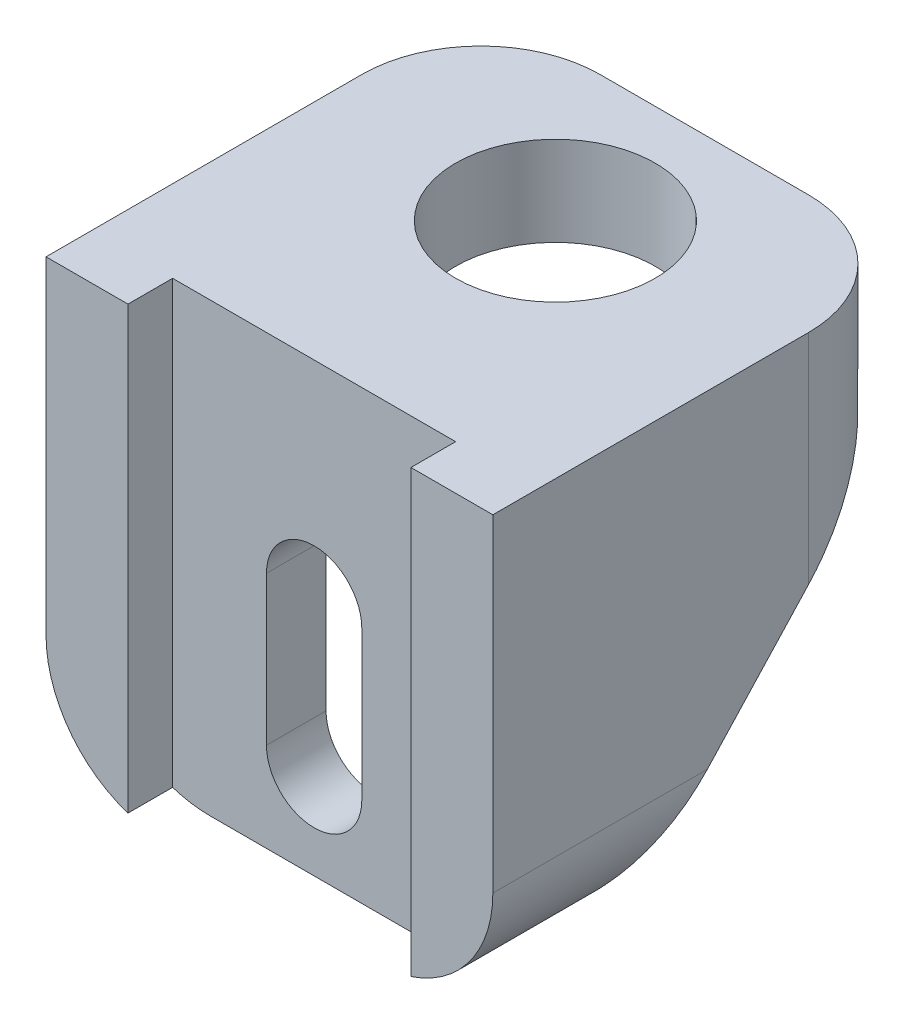
ISO-10303-21;
HEADER;
FILE_DESCRIPTION(('STEP AP214'),'2;1');
FILE_NAME('part.step','',(''),(''),'','','');
FILE_SCHEMA(('AUTOMOTIVE_DESIGN { 1 0 10303 214 1 1 1 1 }'));
ENDSEC;
DATA;
#1=APPLICATION_CONTEXT('core data for automotive mechanical design processes');
#2=APPLICATION_PROTOCOL_DEFINITION('international standard','automotive_design',2000,#1);
#3=PRODUCT_CONTEXT('',#1,'mechanical');
#4=PRODUCT('Part','Part','',(#3));
#5=PRODUCT_RELATED_PRODUCT_CATEGORY('part','',(#4));
#6=PRODUCT_DEFINITION_FORMATION('','',#4);
#7=PRODUCT_DEFINITION_CONTEXT('part definition',#1,'design');
#8=PRODUCT_DEFINITION('design','',#6,#7);
#9=PRODUCT_DEFINITION_SHAPE('','',#8);
#10=(LENGTH_UNIT() NAMED_UNIT(*) SI_UNIT(.MILLI.,.METRE.));
#11=(NAMED_UNIT(*) PLANE_ANGLE_UNIT() SI_UNIT($,.RADIAN.));
#12=(NAMED_UNIT(*) SI_UNIT($,.STERADIAN.) SOLID_ANGLE_UNIT());
#13=UNCERTAINTY_MEASURE_WITH_UNIT(LENGTH_MEASURE(1.E-05),#10,'distance_accuracy_value','');
#14=(GEOMETRIC_REPRESENTATION_CONTEXT(3) GLOBAL_UNCERTAINTY_ASSIGNED_CONTEXT((#13)) GLOBAL_UNIT_ASSIGNED_CONTEXT((#10,
#11,#12)) REPRESENTATION_CONTEXT('',''));
#15=CARTESIAN_POINT('',(0.,0.,0.));
#16=DIRECTION('',(0.,0.,1.));
#17=DIRECTION('',(1.,0.,0.));
#18=AXIS2_PLACEMENT_3D('',#15,#16,#17);
#19=CARTESIAN_POINT('',(0.,0.,0.));
#20=DIRECTION('',(0.,1.,0.));
#21=DIRECTION('',(0.,0.,1.));
#22=AXIS2_PLACEMENT_3D('',#19,#20,#21);
#23=PLANE('',#22);
#24=CARTESIAN_POINT('',(0.,0.,0.));
#25=DIRECTION('',(0.,1.,0.));
#26=DIRECTION('',(0.,0.,1.));
#27=AXIS2_PLACEMENT_3D('',#24,#25,#26);
#28=CIRCLE('',#27,3.35);
#29=CARTESIAN_POINT('',(0.,0.,3.35));
#30=VERTEX_POINT('',#29);
#31=EDGE_CURVE('E278',#30,#30,#28,.T.);
#32=ORIENTED_EDGE('',*,*,#31,.T.);
#33=EDGE_LOOP('',(#32));
#34=FACE_BOUND('',#33,.T.);
#35=DIRECTION('',(1.,0.,0.));
#36=VECTOR('',#35,1.);
#37=CARTESIAN_POINT('',(-7.5,0.,6.1));
#38=LINE('',#37,#36);
#39=CARTESIAN_POINT('',(-4.5,0.,6.1));
#40=VERTEX_POINT('',#39);
#41=CARTESIAN_POINT('',(4.5,0.,6.1));
#42=VERTEX_POINT('',#41);
#43=EDGE_CURVE('E271',#40,#42,#38,.T.);
#44=ORIENTED_EDGE('',*,*,#43,.F.);
#45=CARTESIAN_POINT('',(-4.5,0.,4.1));
#46=DIRECTION('',(0.,1.,0.));
#47=DIRECTION('',(0.,0.,1.));
#48=AXIS2_PLACEMENT_3D('',#45,#46,#47);
#49=CIRCLE('',#48,2.);
#50=CARTESIAN_POINT('',(-6.5,0.,4.1));
#51=VERTEX_POINT('',#50);
#52=EDGE_CURVE('E367',#40,#51,#49,.F.);
#53=ORIENTED_EDGE('',*,*,#52,.T.);
#54=DIRECTION('',(0.,0.,1.));
#55=VECTOR('',#54,1.);
#56=CARTESIAN_POINT('',(-6.5,0.,-5.));
#57=LINE('',#56,#55);
#58=CARTESIAN_POINT('',(-6.5,0.,-3.64575131106459));
#59=VERTEX_POINT('',#58);
#60=EDGE_CURVE('E501',#59,#51,#57,.T.);
#61=ORIENTED_EDGE('',*,*,#60,.F.);
#62=CARTESIAN_POINT('',(-3.5,0.,-1.));
#63=DIRECTION('',(0.,1.,0.));
#64=DIRECTION('',(0.,0.,1.));
#65=AXIS2_PLACEMENT_3D('',#62,#63,#64);
#66=CIRCLE('',#65,4.);
#67=CARTESIAN_POINT('',(-3.5,0.,-5.));
#68=VERTEX_POINT('',#67);
#69=EDGE_CURVE('E346',#59,#68,#66,.F.);
#70=ORIENTED_EDGE('',*,*,#69,.T.);
#71=DIRECTION('',(-1.,0.,0.));
#72=VECTOR('',#71,1.);
#73=CARTESIAN_POINT('',(-7.5,0.,-5.));
#74=LINE('',#73,#72);
#75=CARTESIAN_POINT('',(3.5,0.,-5.));
#76=VERTEX_POINT('',#75);
#77=EDGE_CURVE('E284',#76,#68,#74,.T.);
#78=ORIENTED_EDGE('',*,*,#77,.F.);
#79=CARTESIAN_POINT('',(3.5,0.,-1.));
#80=DIRECTION('',(0.,1.,0.));
#81=DIRECTION('',(0.,0.,1.));
#82=AXIS2_PLACEMENT_3D('',#79,#80,#81);
#83=CIRCLE('',#82,4.);
#84=CARTESIAN_POINT('',(6.5,0.,-3.64575131106459));
#85=VERTEX_POINT('',#84);
#86=EDGE_CURVE('E344',#76,#85,#83,.F.);
#87=ORIENTED_EDGE('',*,*,#86,.T.);
#88=DIRECTION('',(0.,0.,1.));
#89=VECTOR('',#88,1.);
#90=CARTESIAN_POINT('',(6.5,0.,-5.));
#91=LINE('',#90,#89);
#92=CARTESIAN_POINT('',(6.5,0.,4.1));
#93=VERTEX_POINT('',#92);
#94=EDGE_CURVE('E517',#85,#93,#91,.T.);
#95=ORIENTED_EDGE('',*,*,#94,.T.);
#96=CARTESIAN_POINT('',(4.5,0.,4.1));
#97=DIRECTION('',(0.,1.,0.));
#98=DIRECTION('',(0.,0.,1.));
#99=AXIS2_PLACEMENT_3D('',#96,#97,#98);
#100=CIRCLE('',#99,2.);
#101=EDGE_CURVE('E365',#93,#42,#100,.F.);
#102=ORIENTED_EDGE('',*,*,#101,.T.);
#103=EDGE_LOOP('',(#44,#53,#61,#70,#78,#87,#95,#102));
#104=FACE_BOUND('',#103,.T.);
#105=ADVANCED_FACE('F41',(#34,#104),#23,.F.);
#106=CARTESIAN_POINT('',(-7.5,-12.,6.1));
#107=DIRECTION('',(0.,0.,1.));
#108=DIRECTION('',(1.,0.,0.));
#109=AXIS2_PLACEMENT_3D('',#106,#107,#108);
#110=PLANE('',#109);
#111=DIRECTION('',(0.,-1.,0.));
#112=VECTOR('',#111,1.);
#113=CARTESIAN_POINT('',(1.6,-4.,6.1));
#114=LINE('',#113,#112);
#115=CARTESIAN_POINT('',(1.6,-4.,6.1));
#116=VERTEX_POINT('',#115);
#117=CARTESIAN_POINT('',(1.6,-9.,6.1));
#118=VERTEX_POINT('',#117);
#119=EDGE_CURVE('E231',#116,#118,#114,.T.);
#120=ORIENTED_EDGE('',*,*,#119,.F.);
#121=CARTESIAN_POINT('',(0.,-4.,6.1));
#122=DIRECTION('',(0.,0.,-1.));
#123=DIRECTION('',(-1.,0.,0.));
#124=AXIS2_PLACEMENT_3D('',#121,#122,#123);
#125=CIRCLE('',#124,1.6);
#126=CARTESIAN_POINT('',(-1.6,-4.,6.1));
#127=VERTEX_POINT('',#126);
#128=EDGE_CURVE('E210',#127,#116,#125,.T.);
#129=ORIENTED_EDGE('',*,*,#128,.F.);
#130=DIRECTION('',(0.,1.,0.));
#131=VECTOR('',#130,1.);
#132=CARTESIAN_POINT('',(-1.6,-4.,6.1));
#133=LINE('',#132,#131);
#134=CARTESIAN_POINT('',(-1.6,-9.,6.1));
#135=VERTEX_POINT('',#134);
#136=EDGE_CURVE('E215',#135,#127,#133,.T.);
#137=ORIENTED_EDGE('',*,*,#136,.F.);
#138=CARTESIAN_POINT('',(0.,-9.,6.1));
#139=DIRECTION('',(0.,0.,-1.));
#140=DIRECTION('',(-1.,0.,0.));
#141=AXIS2_PLACEMENT_3D('',#138,#139,#140);
#142=CIRCLE('',#141,1.6);
#143=EDGE_CURVE('E238',#118,#135,#142,.T.);
#144=ORIENTED_EDGE('',*,*,#143,.F.);
#145=EDGE_LOOP('',(#120,#129,#137,#144));
#146=FACE_BOUND('',#145,.T.);
#147=CARTESIAN_POINT('',(-3.5,-8.,6.1));
#148=DIRECTION('',(0.,0.,1.));
#149=DIRECTION('',(1.,0.,0.));
#150=AXIS2_PLACEMENT_3D('',#147,#148,#149);
#151=CIRCLE('',#150,4.);
#152=CARTESIAN_POINT('',(-3.5,-12.,6.1));
#153=VERTEX_POINT('',#152);
#154=CARTESIAN_POINT('',(-4.5,-11.8729833462074,6.1));
#155=VERTEX_POINT('',#154);
#156=EDGE_CURVE('E308',#153,#155,#151,.F.);
#157=ORIENTED_EDGE('',*,*,#156,.T.);
#158=DIRECTION('',(0.,-1.,0.));
#159=VECTOR('',#158,1.);
#160=CARTESIAN_POINT('',(-4.5,0.,6.1));
#161=LINE('',#160,#159);
#162=EDGE_CURVE('E363',#155,#40,#161,.F.);
#163=ORIENTED_EDGE('',*,*,#162,.T.);
#164=ORIENTED_EDGE('',*,*,#43,.T.);
#165=DIRECTION('',(0.,-1.,0.));
#166=VECTOR('',#165,1.);
#167=CARTESIAN_POINT('',(4.5,-10.6457513110646,6.1));
#168=LINE('',#167,#166);
#169=CARTESIAN_POINT('',(4.5,-11.8729833462074,6.1));
#170=VERTEX_POINT('',#169);
#171=EDGE_CURVE('E360',#42,#170,#168,.T.);
#172=ORIENTED_EDGE('',*,*,#171,.T.);
#173=CARTESIAN_POINT('',(3.5,-8.,6.1));
#174=DIRECTION('',(0.,0.,1.));
#175=DIRECTION('',(1.,0.,0.));
#176=AXIS2_PLACEMENT_3D('',#173,#174,#175);
#177=CIRCLE('',#176,4.);
#178=CARTESIAN_POINT('',(3.5,-12.,6.1));
#179=VERTEX_POINT('',#178);
#180=EDGE_CURVE('E306',#170,#179,#177,.F.);
#181=ORIENTED_EDGE('',*,*,#180,.T.);
#182=DIRECTION('',(1.,0.,0.));
#183=VECTOR('',#182,1.);
#184=CARTESIAN_POINT('',(-7.5,-12.,6.1));
#185=LINE('',#184,#183);
#186=EDGE_CURVE('E272',#153,#179,#185,.T.);
#187=ORIENTED_EDGE('',*,*,#186,.F.);
#188=EDGE_LOOP('',(#157,#163,#164,#172,#181,#187));
#189=FACE_BOUND('',#188,.T.);
#190=ADVANCED_FACE('F411',(#146,#189),#110,.F.);
#191=CARTESIAN_POINT('',(-7.5,3.,8.1));
#192=DIRECTION('',(0.,0.,-1.));
#193=DIRECTION('',(-1.,0.,0.));
#194=AXIS2_PLACEMENT_3D('',#191,#192,#193);
#195=PLANE('',#194);
#196=DIRECTION('',(0.,-1.,0.));
#197=VECTOR('',#196,1.);
#198=CARTESIAN_POINT('',(-1.6,-4.,8.1));
#199=LINE('',#198,#197);
#200=CARTESIAN_POINT('',(-1.6,-4.,8.1));
#201=VERTEX_POINT('',#200);
#202=CARTESIAN_POINT('',(-1.6,-9.,8.1));
#203=VERTEX_POINT('',#202);
#204=EDGE_CURVE('E229',#201,#203,#199,.T.);
#205=ORIENTED_EDGE('',*,*,#204,.F.);
#206=CARTESIAN_POINT('',(0.,-4.,8.1));
#207=DIRECTION('',(0.,0.,-1.));
#208=DIRECTION('',(-1.,0.,0.));
#209=AXIS2_PLACEMENT_3D('',#206,#207,#208);
#210=CIRCLE('',#209,1.6);
#211=CARTESIAN_POINT('',(1.6,-4.,8.1));
#212=VERTEX_POINT('',#211);
#213=EDGE_CURVE('E207',#212,#201,#210,.F.);
#214=ORIENTED_EDGE('',*,*,#213,.F.);
#215=DIRECTION('',(0.,1.,0.));
#216=VECTOR('',#215,1.);
#217=CARTESIAN_POINT('',(1.6,-4.,8.1));
#218=LINE('',#217,#216);
#219=CARTESIAN_POINT('',(1.6,-9.,8.1));
#220=VERTEX_POINT('',#219);
#221=EDGE_CURVE('E219',#220,#212,#218,.T.);
#222=ORIENTED_EDGE('',*,*,#221,.F.);
#223=CARTESIAN_POINT('',(0.,-9.,8.1));
#224=DIRECTION('',(0.,0.,-1.));
#225=DIRECTION('',(-1.,0.,0.));
#226=AXIS2_PLACEMENT_3D('',#223,#224,#225);
#227=CIRCLE('',#226,1.6);
#228=EDGE_CURVE('E233',#203,#220,#227,.F.);
#229=ORIENTED_EDGE('',*,*,#228,.F.);
#230=EDGE_LOOP('',(#205,#214,#222,#229));
#231=FACE_BOUND('',#230,.T.);
#232=DIRECTION('',(0.,1.,0.));
#233=VECTOR('',#232,1.);
#234=CARTESIAN_POINT('',(-4.75,-15.1324910215354,8.1));
#235=LINE('',#234,#233);
#236=CARTESIAN_POINT('',(-4.75,-11.7996710383927,8.1));
#237=VERTEX_POINT('',#236);
#238=CARTESIAN_POINT('',(-4.75,3.,8.1));
#239=VERTEX_POINT('',#238);
#240=EDGE_CURVE('E265',#237,#239,#235,.T.);
#241=ORIENTED_EDGE('',*,*,#240,.F.);
#242=CARTESIAN_POINT('',(-3.5,-8.,8.1));
#243=DIRECTION('',(0.,0.,-1.));
#244=DIRECTION('',(-1.,0.,0.));
#245=AXIS2_PLACEMENT_3D('',#242,#243,#244);
#246=CIRCLE('',#245,4.);
#247=CARTESIAN_POINT('',(-3.5,-12.,8.1));
#248=VERTEX_POINT('',#247);
#249=EDGE_CURVE('E328',#237,#248,#246,.F.);
#250=ORIENTED_EDGE('',*,*,#249,.T.);
#251=DIRECTION('',(-1.,0.,0.));
#252=VECTOR('',#251,1.);
#253=CARTESIAN_POINT('',(-7.5,-12.,8.1));
#254=LINE('',#253,#252);
#255=CARTESIAN_POINT('',(3.5,-12.,8.1));
#256=VERTEX_POINT('',#255);
#257=EDGE_CURVE('E275',#256,#248,#254,.T.);
#258=ORIENTED_EDGE('',*,*,#257,.F.);
#259=CARTESIAN_POINT('',(3.5,-8.,8.1));
#260=DIRECTION('',(0.,0.,-1.));
#261=DIRECTION('',(-1.,0.,0.));
#262=AXIS2_PLACEMENT_3D('',#259,#260,#261);
#263=CIRCLE('',#262,4.);
#264=CARTESIAN_POINT('',(4.75,-11.7996710383927,8.1));
#265=VERTEX_POINT('',#264);
#266=EDGE_CURVE('E326',#256,#265,#263,.F.);
#267=ORIENTED_EDGE('',*,*,#266,.T.);
#268=DIRECTION('',(0.,1.,0.));
#269=VECTOR('',#268,1.);
#270=CARTESIAN_POINT('',(4.75,-15.1324910215354,8.1));
#271=LINE('',#270,#269);
#272=CARTESIAN_POINT('',(4.75,3.,8.1));
#273=VERTEX_POINT('',#272);
#274=EDGE_CURVE('E247',#265,#273,#271,.T.);
#275=ORIENTED_EDGE('',*,*,#274,.T.);
#276=DIRECTION('',(1.,0.,0.));
#277=VECTOR('',#276,1.);
#278=CARTESIAN_POINT('',(-7.5,3.,8.1));
#279=LINE('',#278,#277);
#280=EDGE_CURVE('E289',#239,#273,#279,.T.);
#281=ORIENTED_EDGE('',*,*,#280,.F.);
#282=EDGE_LOOP('',(#241,#250,#258,#267,#275,#281));
#283=FACE_BOUND('',#282,.T.);
#284=ADVANCED_FACE('F226',(#231,#283),#195,.F.);
#285=CARTESIAN_POINT('',(0.,3.,0.));
#286=DIRECTION('',(0.,1.,0.));
#287=DIRECTION('',(0.,0.,1.));
#288=AXIS2_PLACEMENT_3D('',#285,#286,#287);
#289=PLANE('',#288);
#290=DIRECTION('',(-1.,0.,0.));
#291=VECTOR('',#290,1.);
#292=CARTESIAN_POINT('',(-7.5,3.,-5.));
#293=LINE('',#292,#291);
#294=CARTESIAN_POINT('',(3.5,3.,-5.));
#295=VERTEX_POINT('',#294);
#296=CARTESIAN_POINT('',(-3.5,3.,-5.));
#297=VERTEX_POINT('',#296);
#298=EDGE_CURVE('E295',#295,#297,#293,.T.);
#299=ORIENTED_EDGE('',*,*,#298,.T.);
#300=CARTESIAN_POINT('',(-3.5,3.,-1.));
#301=DIRECTION('',(0.,1.,0.));
#302=DIRECTION('',(0.,0.,1.));
#303=AXIS2_PLACEMENT_3D('',#300,#301,#302);
#304=CIRCLE('',#303,4.);
#305=CARTESIAN_POINT('',(-7.5,3.,-1.));
#306=VERTEX_POINT('',#305);
#307=EDGE_CURVE('E355',#297,#306,#304,.T.);
#308=ORIENTED_EDGE('',*,*,#307,.T.);
#309=DIRECTION('',(0.,0.,1.));
#310=VECTOR('',#309,1.);
#311=CARTESIAN_POINT('',(-7.5,3.,-5.));
#312=LINE('',#311,#310);
#313=CARTESIAN_POINT('',(-7.5,3.,9.6));
#314=VERTEX_POINT('',#313);
#315=EDGE_CURVE('E287',#306,#314,#312,.T.);
#316=ORIENTED_EDGE('',*,*,#315,.T.);
#317=DIRECTION('',(1.,0.,0.));
#318=VECTOR('',#317,1.);
#319=CARTESIAN_POINT('',(-7.5,3.,9.6));
#320=LINE('',#319,#318);
#321=CARTESIAN_POINT('',(-4.75,3.,9.6));
#322=VERTEX_POINT('',#321);
#323=EDGE_CURVE('E256',#314,#322,#320,.T.);
#324=ORIENTED_EDGE('',*,*,#323,.T.);
#325=DIRECTION('',(0.,0.,-1.));
#326=VECTOR('',#325,1.);
#327=CARTESIAN_POINT('',(-4.75,3.,8.1));
#328=LINE('',#327,#326);
#329=EDGE_CURVE('E259',#322,#239,#328,.T.);
#330=ORIENTED_EDGE('',*,*,#329,.T.);
#331=ORIENTED_EDGE('',*,*,#280,.T.);
#332=DIRECTION('',(0.,0.,1.));
#333=VECTOR('',#332,1.);
#334=CARTESIAN_POINT('',(4.75,3.,8.1));
#335=LINE('',#334,#333);
#336=CARTESIAN_POINT('',(4.75,3.,9.6));
#337=VERTEX_POINT('',#336);
#338=EDGE_CURVE('E253',#273,#337,#335,.T.);
#339=ORIENTED_EDGE('',*,*,#338,.T.);
#340=DIRECTION('',(1.,0.,0.));
#341=VECTOR('',#340,1.);
#342=CARTESIAN_POINT('',(7.5,3.,9.6));
#343=LINE('',#342,#341);
#344=CARTESIAN_POINT('',(7.5,3.,9.6));
#345=VERTEX_POINT('',#344);
#346=EDGE_CURVE('E249',#337,#345,#343,.T.);
#347=ORIENTED_EDGE('',*,*,#346,.T.);
#348=DIRECTION('',(0.,0.,-1.));
#349=VECTOR('',#348,1.);
#350=CARTESIAN_POINT('',(7.5,3.,-5.));
#351=LINE('',#350,#349);
#352=CARTESIAN_POINT('',(7.5,3.,-1.));
#353=VERTEX_POINT('',#352);
#354=EDGE_CURVE('E292',#345,#353,#351,.T.);
#355=ORIENTED_EDGE('',*,*,#354,.T.);
#356=CARTESIAN_POINT('',(3.5,3.,-1.));
#357=DIRECTION('',(0.,1.,0.));
#358=DIRECTION('',(0.,0.,1.));
#359=AXIS2_PLACEMENT_3D('',#356,#357,#358);
#360=CIRCLE('',#359,4.);
#361=EDGE_CURVE('E353',#353,#295,#360,.T.);
#362=ORIENTED_EDGE('',*,*,#361,.T.);
#363=EDGE_LOOP('',(#299,#308,#316,#324,#330,#331,#339,#347,#355,#362));
#364=FACE_BOUND('',#363,.T.);
#365=CARTESIAN_POINT('',(0.,3.,0.));
#366=DIRECTION('',(0.,1.,0.));
#367=DIRECTION('',(0.,0.,1.));
#368=AXIS2_PLACEMENT_3D('',#365,#366,#367);
#369=CIRCLE('',#368,3.35);
#370=CARTESIAN_POINT('',(0.,3.,3.35));
#371=VERTEX_POINT('',#370);
#372=EDGE_CURVE('E281',#371,#371,#369,.T.);
#373=ORIENTED_EDGE('',*,*,#372,.F.);
#374=EDGE_LOOP('',(#373));
#375=FACE_BOUND('',#374,.T.);
#376=ADVANCED_FACE('F422',(#364,#375),#289,.T.);
#377=CARTESIAN_POINT('',(-7.5,3.,-5.));
#378=DIRECTION('',(1.,0.,0.));
#379=DIRECTION('',(0.,0.,-1.));
#380=AXIS2_PLACEMENT_3D('',#377,#378,#379);
#381=PLANE('',#380);
#382=DIRECTION('',(0.,0.734099439586408,-0.679041981617427));
#383=VECTOR('',#382,1.);
#384=CARTESIAN_POINT('',(-7.5,-12.,6.1));
#385=LINE('',#384,#383);
#386=CARTESIAN_POINT('',(-7.5,-8.,2.4));
#387=VERTEX_POINT('',#386);
#388=CARTESIAN_POINT('',(-7.5,-4.32432432432432,-1.));
#389=VERTEX_POINT('',#388);
#390=EDGE_CURVE('E507',#387,#389,#385,.T.);
#391=ORIENTED_EDGE('',*,*,#390,.F.);
#392=DIRECTION('',(0.,0.,-1.));
#393=VECTOR('',#392,1.);
#394=CARTESIAN_POINT('',(-7.5,-8.,9.6));
#395=LINE('',#394,#393);
#396=CARTESIAN_POINT('',(-7.5,-8.,9.6));
#397=VERTEX_POINT('',#396);
#398=EDGE_CURVE('E320',#387,#397,#395,.F.);
#399=ORIENTED_EDGE('',*,*,#398,.T.);
#400=DIRECTION('',(0.,1.,0.));
#401=VECTOR('',#400,1.);
#402=CARTESIAN_POINT('',(-7.5,-15.1324910215354,9.6));
#403=LINE('',#402,#401);
#404=EDGE_CURVE('E267',#397,#314,#403,.T.);
#405=ORIENTED_EDGE('',*,*,#404,.T.);
#406=ORIENTED_EDGE('',*,*,#315,.F.);
#407=DIRECTION('',(0.,-1.,0.));
#408=VECTOR('',#407,1.);
#409=CARTESIAN_POINT('',(-7.5,3.,-1.));
#410=LINE('',#409,#408);
#411=EDGE_CURVE('E317',#306,#389,#410,.T.);
#412=ORIENTED_EDGE('',*,*,#411,.T.);
#413=EDGE_LOOP('',(#391,#399,#405,#406,#412));
#414=FACE_BOUND('',#413,.T.);
#415=ADVANCED_FACE('F393',(#414),#381,.F.);
#416=CARTESIAN_POINT('',(7.5,3.,-5.));
#417=DIRECTION('',(-1.,0.,0.));
#418=DIRECTION('',(0.,0.,1.));
#419=AXIS2_PLACEMENT_3D('',#416,#417,#418);
#420=PLANE('',#419);
#421=DIRECTION('',(0.,1.,0.));
#422=VECTOR('',#421,1.);
#423=CARTESIAN_POINT('',(7.5,-15.1324910215354,9.6));
#424=LINE('',#423,#422);
#425=CARTESIAN_POINT('',(7.5,-8.,9.6));
#426=VERTEX_POINT('',#425);
#427=EDGE_CURVE('E223',#426,#345,#424,.T.);
#428=ORIENTED_EDGE('',*,*,#427,.F.);
#429=DIRECTION('',(0.,0.,1.));
#430=VECTOR('',#429,1.);
#431=CARTESIAN_POINT('',(7.5,-8.,6.1));
#432=LINE('',#431,#430);
#433=CARTESIAN_POINT('',(7.5,-8.,2.4));
#434=VERTEX_POINT('',#433);
#435=EDGE_CURVE('E336',#426,#434,#432,.F.);
#436=ORIENTED_EDGE('',*,*,#435,.T.);
#437=DIRECTION('',(0.,0.734099439586408,-0.679041981617427));
#438=VECTOR('',#437,1.);
#439=CARTESIAN_POINT('',(7.5,-12.,6.1));
#440=LINE('',#439,#438);
#441=CARTESIAN_POINT('',(7.5,-4.32432432432432,-1.));
#442=VERTEX_POINT('',#441);
#443=EDGE_CURVE('E514',#434,#442,#440,.T.);
#444=ORIENTED_EDGE('',*,*,#443,.T.);
#445=DIRECTION('',(0.,-1.,0.));
#446=VECTOR('',#445,1.);
#447=CARTESIAN_POINT('',(7.5,3.,-1.));
#448=LINE('',#447,#446);
#449=EDGE_CURVE('E334',#442,#353,#448,.F.);
#450=ORIENTED_EDGE('',*,*,#449,.T.);
#451=ORIENTED_EDGE('',*,*,#354,.F.);
#452=EDGE_LOOP('',(#428,#436,#444,#450,#451));
#453=FACE_BOUND('',#452,.T.);
#454=ADVANCED_FACE('F428',(#453),#420,.F.);
#455=CARTESIAN_POINT('',(-7.5,3.,-5.));
#456=DIRECTION('',(0.,0.,1.));
#457=DIRECTION('',(1.,0.,0.));
#458=AXIS2_PLACEMENT_3D('',#455,#456,#457);
#459=PLANE('',#458);
#460=ORIENTED_EDGE('',*,*,#77,.T.);
#461=DIRECTION('',(0.,-1.,0.));
#462=VECTOR('',#461,1.);
#463=CARTESIAN_POINT('',(-3.5,3.,-5.));
#464=LINE('',#463,#462);
#465=EDGE_CURVE('E351',#68,#297,#464,.F.);
#466=ORIENTED_EDGE('',*,*,#465,.T.);
#467=ORIENTED_EDGE('',*,*,#298,.F.);
#468=DIRECTION('',(0.,-1.,0.));
#469=VECTOR('',#468,1.);
#470=CARTESIAN_POINT('',(3.5,3.,-5.));
#471=LINE('',#470,#469);
#472=EDGE_CURVE('E348',#295,#76,#471,.T.);
#473=ORIENTED_EDGE('',*,*,#472,.T.);
#474=EDGE_LOOP('',(#460,#466,#467,#473));
#475=FACE_BOUND('',#474,.T.);
#476=ADVANCED_FACE('F424',(#475),#459,.F.);
#477=CARTESIAN_POINT('',(0.,3.,0.));
#478=DIRECTION('',(0.,-1.,0.));
#479=DIRECTION('',(0.,0.,-1.));
#480=AXIS2_PLACEMENT_3D('',#477,#478,#479);
#481=CYLINDRICAL_SURFACE('',#480,3.35);
#482=ORIENTED_EDGE('',*,*,#372,.T.);
#483=EDGE_LOOP('',(#482));
#484=FACE_BOUND('',#483,.T.);
#485=ORIENTED_EDGE('',*,*,#31,.F.);
#486=EDGE_LOOP('',(#485));
#487=FACE_BOUND('',#486,.T.);
#488=ADVANCED_FACE('F427',(#484,#487),#481,.F.);
#489=CARTESIAN_POINT('',(0.,-12.,0.));
#490=DIRECTION('',(0.,-1.,0.));
#491=DIRECTION('',(0.,0.,-1.));
#492=AXIS2_PLACEMENT_3D('',#489,#490,#491);
#493=PLANE('',#492);
#494=ORIENTED_EDGE('',*,*,#257,.T.);
#495=DIRECTION('',(0.,0.,-1.));
#496=VECTOR('',#495,1.);
#497=CARTESIAN_POINT('',(-3.5,-12.,6.1));
#498=LINE('',#497,#496);
#499=EDGE_CURVE('E303',#248,#153,#498,.T.);
#500=ORIENTED_EDGE('',*,*,#499,.T.);
#501=ORIENTED_EDGE('',*,*,#186,.T.);
#502=DIRECTION('',(0.,0.,1.));
#503=VECTOR('',#502,1.);
#504=CARTESIAN_POINT('',(3.5,-12.,9.6));
#505=LINE('',#504,#503);
#506=EDGE_CURVE('E298',#179,#256,#505,.T.);
#507=ORIENTED_EDGE('',*,*,#506,.T.);
#508=EDGE_LOOP('',(#494,#500,#501,#507));
#509=FACE_BOUND('',#508,.T.);
#510=ADVANCED_FACE('F448',(#509),#493,.T.);
#511=CARTESIAN_POINT('',(-7.5,-15.1324910215354,9.6));
#512=DIRECTION('',(0.,0.,1.));
#513=DIRECTION('',(1.,0.,0.));
#514=AXIS2_PLACEMENT_3D('',#511,#512,#513);
#515=PLANE('',#514);
#516=ORIENTED_EDGE('',*,*,#404,.F.);
#517=CARTESIAN_POINT('',(-3.5,-8.,9.6));
#518=DIRECTION('',(0.,0.,1.));
#519=DIRECTION('',(1.,0.,0.));
#520=AXIS2_PLACEMENT_3D('',#517,#518,#519);
#521=CIRCLE('',#520,4.);
#522=CARTESIAN_POINT('',(-4.75,-11.7996710383927,9.6));
#523=VERTEX_POINT('',#522);
#524=EDGE_CURVE('E322',#397,#523,#521,.T.);
#525=ORIENTED_EDGE('',*,*,#524,.T.);
#526=DIRECTION('',(0.,1.,0.));
#527=VECTOR('',#526,1.);
#528=CARTESIAN_POINT('',(-4.75,-15.1324910215354,9.6));
#529=LINE('',#528,#527);
#530=EDGE_CURVE('E262',#523,#322,#529,.T.);
#531=ORIENTED_EDGE('',*,*,#530,.T.);
#532=ORIENTED_EDGE('',*,*,#323,.F.);
#533=EDGE_LOOP('',(#516,#525,#531,#532));
#534=FACE_BOUND('',#533,.T.);
#535=ADVANCED_FACE('F453',(#534),#515,.T.);
#536=CARTESIAN_POINT('',(-4.75,-15.1324910215354,8.1));
#537=DIRECTION('',(1.,0.,0.));
#538=DIRECTION('',(0.,0.,-1.));
#539=AXIS2_PLACEMENT_3D('',#536,#537,#538);
#540=PLANE('',#539);
#541=ORIENTED_EDGE('',*,*,#530,.F.);
#542=DIRECTION('',(0.,0.,1.));
#543=VECTOR('',#542,1.);
#544=CARTESIAN_POINT('',(-4.75,-11.7996710383927,9.6));
#545=LINE('',#544,#543);
#546=EDGE_CURVE('E324',#523,#237,#545,.F.);
#547=ORIENTED_EDGE('',*,*,#546,.T.);
#548=ORIENTED_EDGE('',*,*,#240,.T.);
#549=ORIENTED_EDGE('',*,*,#329,.F.);
#550=EDGE_LOOP('',(#541,#547,#548,#549));
#551=FACE_BOUND('',#550,.T.);
#552=ADVANCED_FACE('F459',(#551),#540,.T.);
#553=CARTESIAN_POINT('',(4.75,-15.1324910215354,8.1));
#554=DIRECTION('',(-1.,0.,0.));
#555=DIRECTION('',(0.,0.,1.));
#556=AXIS2_PLACEMENT_3D('',#553,#554,#555);
#557=PLANE('',#556);
#558=ORIENTED_EDGE('',*,*,#274,.F.);
#559=DIRECTION('',(0.,0.,-1.));
#560=VECTOR('',#559,1.);
#561=CARTESIAN_POINT('',(4.75,-11.7996710383927,8.1));
#562=LINE('',#561,#560);
#563=CARTESIAN_POINT('',(4.75,-11.7996710383927,9.6));
#564=VERTEX_POINT('',#563);
#565=EDGE_CURVE('E330',#265,#564,#562,.F.);
#566=ORIENTED_EDGE('',*,*,#565,.T.);
#567=DIRECTION('',(0.,1.,0.));
#568=VECTOR('',#567,1.);
#569=CARTESIAN_POINT('',(4.75,-15.1324910215354,9.6));
#570=LINE('',#569,#568);
#571=EDGE_CURVE('E250',#564,#337,#570,.T.);
#572=ORIENTED_EDGE('',*,*,#571,.T.);
#573=ORIENTED_EDGE('',*,*,#338,.F.);
#574=EDGE_LOOP('',(#558,#566,#572,#573));
#575=FACE_BOUND('',#574,.T.);
#576=ADVANCED_FACE('F463',(#575),#557,.T.);
#577=CARTESIAN_POINT('',(7.5,-15.1324910215354,9.6));
#578=DIRECTION('',(0.,0.,1.));
#579=DIRECTION('',(1.,0.,0.));
#580=AXIS2_PLACEMENT_3D('',#577,#578,#579);
#581=PLANE('',#580);
#582=ORIENTED_EDGE('',*,*,#571,.F.);
#583=CARTESIAN_POINT('',(3.5,-8.,9.6));
#584=DIRECTION('',(0.,0.,1.));
#585=DIRECTION('',(1.,0.,0.));
#586=AXIS2_PLACEMENT_3D('',#583,#584,#585);
#587=CIRCLE('',#586,4.);
#588=EDGE_CURVE('E332',#564,#426,#587,.T.);
#589=ORIENTED_EDGE('',*,*,#588,.T.);
#590=ORIENTED_EDGE('',*,*,#427,.T.);
#591=ORIENTED_EDGE('',*,*,#346,.F.);
#592=EDGE_LOOP('',(#582,#589,#590,#591));
#593=FACE_BOUND('',#592,.T.);
#594=ADVANCED_FACE('F465',(#593),#581,.T.);
#595=CARTESIAN_POINT('',(0.,-4.,9.601));
#596=DIRECTION('',(0.,0.,-1.));
#597=DIRECTION('',(-1.,0.,0.));
#598=AXIS2_PLACEMENT_3D('',#595,#596,#597);
#599=CYLINDRICAL_SURFACE('',#598,1.6);
#600=ORIENTED_EDGE('',*,*,#213,.T.);
#601=DIRECTION('',(0.,0.,-1.));
#602=VECTOR('',#601,1.);
#603=CARTESIAN_POINT('',(-1.6,-4.,9.601));
#604=LINE('',#603,#602);
#605=EDGE_CURVE('E224',#201,#127,#604,.T.);
#606=ORIENTED_EDGE('',*,*,#605,.T.);
#607=ORIENTED_EDGE('',*,*,#128,.T.);
#608=DIRECTION('',(0.,0.,-1.));
#609=VECTOR('',#608,1.);
#610=CARTESIAN_POINT('',(1.6,-4.,9.601));
#611=LINE('',#610,#609);
#612=EDGE_CURVE('E203',#212,#116,#611,.T.);
#613=ORIENTED_EDGE('',*,*,#612,.F.);
#614=EDGE_LOOP('',(#600,#606,#607,#613));
#615=FACE_BOUND('',#614,.T.);
#616=ADVANCED_FACE('F205',(#615),#599,.F.);
#617=CARTESIAN_POINT('',(-1.6,-4.,9.601));
#618=DIRECTION('',(-1.,0.,0.));
#619=DIRECTION('',(0.,-1.,0.));
#620=AXIS2_PLACEMENT_3D('',#617,#618,#619);
#621=PLANE('',#620);
#622=ORIENTED_EDGE('',*,*,#204,.T.);
#623=DIRECTION('',(0.,0.,-1.));
#624=VECTOR('',#623,1.);
#625=CARTESIAN_POINT('',(-1.6,-9.,9.601));
#626=LINE('',#625,#624);
#627=EDGE_CURVE('E244',#203,#135,#626,.T.);
#628=ORIENTED_EDGE('',*,*,#627,.T.);
#629=ORIENTED_EDGE('',*,*,#136,.T.);
#630=ORIENTED_EDGE('',*,*,#605,.F.);
#631=EDGE_LOOP('',(#622,#628,#629,#630));
#632=FACE_BOUND('',#631,.T.);
#633=ADVANCED_FACE('F474',(#632),#621,.F.);
#634=CARTESIAN_POINT('',(0.,-9.,9.601));
#635=DIRECTION('',(0.,0.,-1.));
#636=DIRECTION('',(-1.,0.,0.));
#637=AXIS2_PLACEMENT_3D('',#634,#635,#636);
#638=CYLINDRICAL_SURFACE('',#637,1.6);
#639=ORIENTED_EDGE('',*,*,#228,.T.);
#640=DIRECTION('',(0.,0.,-1.));
#641=VECTOR('',#640,1.);
#642=CARTESIAN_POINT('',(1.6,-9.,9.601));
#643=LINE('',#642,#641);
#644=EDGE_CURVE('E214',#220,#118,#643,.T.);
#645=ORIENTED_EDGE('',*,*,#644,.T.);
#646=ORIENTED_EDGE('',*,*,#143,.T.);
#647=ORIENTED_EDGE('',*,*,#627,.F.);
#648=EDGE_LOOP('',(#639,#645,#646,#647));
#649=FACE_BOUND('',#648,.T.);
#650=ADVANCED_FACE('F478',(#649),#638,.F.);
#651=CARTESIAN_POINT('',(1.6,-4.,9.601));
#652=DIRECTION('',(1.,0.,0.));
#653=DIRECTION('',(0.,1.,0.));
#654=AXIS2_PLACEMENT_3D('',#651,#652,#653);
#655=PLANE('',#654);
#656=ORIENTED_EDGE('',*,*,#221,.T.);
#657=ORIENTED_EDGE('',*,*,#612,.T.);
#658=ORIENTED_EDGE('',*,*,#119,.T.);
#659=ORIENTED_EDGE('',*,*,#644,.F.);
#660=EDGE_LOOP('',(#656,#657,#658,#659));
#661=FACE_BOUND('',#660,.T.);
#662=ADVANCED_FACE('F220',(#661),#655,.F.);
#663=CARTESIAN_POINT('',(6.5,-12.,6.1));
#664=DIRECTION('',(0.,-0.679041981617427,-0.734099439586408));
#665=DIRECTION('',(0.,0.734099439586408,-0.679041981617427));
#666=AXIS2_PLACEMENT_3D('',#663,#664,#665);
#667=PLANE('',#666);
#668=ORIENTED_EDGE('',*,*,#443,.F.);
#669=CARTESIAN_POINT('',(3.5,-8.,2.4));
#670=DIRECTION('',(0.,-0.679041981617427,-0.734099439586408));
#671=DIRECTION('',(0.,0.734099439586408,-0.679041981617427));
#672=AXIS2_PLACEMENT_3D('',#669,#670,#671);
#673=ELLIPSE('',#672,5.44885309033011,4.);
#674=CARTESIAN_POINT('',(6.22914640888472,-10.9243392208962,5.10501377932896));
#675=VERTEX_POINT('',#674);
#676=EDGE_CURVE('E56',#434,#675,#673,.T.);
#677=ORIENTED_EDGE('',*,*,#676,.T.);
#678=CARTESIAN_POINT('',(4.5,-9.83783783783784,4.1));
#679=DIRECTION('',(0.,-0.679041981617427,-0.734099439586408));
#680=DIRECTION('',(0.,0.734099439586408,-0.679041981617427));
#681=AXIS2_PLACEMENT_3D('',#678,#679,#680);
#682=ELLIPSE('',#681,2.94532599477303,2.);
#683=CARTESIAN_POINT('',(6.5,-9.83783783783784,4.1));
#684=VERTEX_POINT('',#683);
#685=EDGE_CURVE('E11',#675,#684,#682,.F.);
#686=ORIENTED_EDGE('',*,*,#685,.T.);
#687=DIRECTION('',(0.,0.734099439586408,-0.679041981617427));
#688=VECTOR('',#687,1.);
#689=CARTESIAN_POINT('',(6.5,-12.,6.1));
#690=LINE('',#689,#688);
#691=CARTESIAN_POINT('',(6.5,-1.46405263668693,-3.64575131106459));
#692=VERTEX_POINT('',#691);
#693=EDGE_CURVE('E523',#684,#692,#690,.T.);
#694=ORIENTED_EDGE('',*,*,#693,.T.);
#695=CARTESIAN_POINT('',(3.5,-4.32432432432432,-1.));
#696=DIRECTION('',(0.,-0.679041981617427,-0.734099439586408));
#697=DIRECTION('',(0.,-0.734099439586408,0.679041981617427));
#698=AXIS2_PLACEMENT_3D('',#695,#696,#697);
#699=ELLIPSE('',#698,5.89065198954607,4.);
#700=EDGE_CURVE('E338',#692,#442,#699,.T.);
#701=ORIENTED_EDGE('',*,*,#700,.T.);
#702=EDGE_LOOP('',(#668,#677,#686,#694,#701));
#703=FACE_BOUND('',#702,.T.);
#704=ADVANCED_FACE('F477',(#703),#667,.T.);
#705=CARTESIAN_POINT('',(6.5,0.,0.));
#706=DIRECTION('',(1.,0.,0.));
#707=DIRECTION('',(0.,0.,-1.));
#708=AXIS2_PLACEMENT_3D('',#705,#706,#707);
#709=PLANE('',#708);
#710=ORIENTED_EDGE('',*,*,#693,.F.);
#711=DIRECTION('',(0.,-1.,0.));
#712=VECTOR('',#711,1.);
#713=CARTESIAN_POINT('',(6.5,0.,4.1));
#714=LINE('',#713,#712);
#715=EDGE_CURVE('E369',#684,#93,#714,.F.);
#716=ORIENTED_EDGE('',*,*,#715,.T.);
#717=ORIENTED_EDGE('',*,*,#94,.F.);
#718=DIRECTION('',(0.,-1.,0.));
#719=VECTOR('',#718,1.);
#720=CARTESIAN_POINT('',(6.5,0.,-3.64575131106459));
#721=LINE('',#720,#719);
#722=EDGE_CURVE('E341',#85,#692,#721,.T.);
#723=ORIENTED_EDGE('',*,*,#722,.T.);
#724=EDGE_LOOP('',(#710,#716,#717,#723));
#725=FACE_BOUND('',#724,.T.);
#726=ADVANCED_FACE('F487',(#725),#709,.F.);
#727=CARTESIAN_POINT('',(-6.5,-12.,6.1));
#728=DIRECTION('',(0.,0.679041981617427,0.734099439586408));
#729=DIRECTION('',(0.,-0.734099439586408,0.679041981617427));
#730=AXIS2_PLACEMENT_3D('',#727,#728,#729);
#731=PLANE('',#730);
#732=DIRECTION('',(0.,0.734099439586408,-0.679041981617427));
#733=VECTOR('',#732,1.);
#734=CARTESIAN_POINT('',(-6.5,-12.,6.1));
#735=LINE('',#734,#733);
#736=CARTESIAN_POINT('',(-6.5,-9.83783783783784,4.1));
#737=VERTEX_POINT('',#736);
#738=CARTESIAN_POINT('',(-6.5,-1.46405263668693,-3.64575131106459));
#739=VERTEX_POINT('',#738);
#740=EDGE_CURVE('E506',#737,#739,#735,.T.);
#741=ORIENTED_EDGE('',*,*,#740,.F.);
#742=CARTESIAN_POINT('',(-4.5,-9.83783783783784,4.1));
#743=DIRECTION('',(0.,0.679041981617427,0.734099439586408));
#744=DIRECTION('',(0.,0.734099439586408,-0.679041981617427));
#745=AXIS2_PLACEMENT_3D('',#742,#743,#744);
#746=ELLIPSE('',#745,2.94532599477303,2.);
#747=CARTESIAN_POINT('',(-6.22914640888473,-10.9243392208962,5.10501377932895));
#748=VERTEX_POINT('',#747);
#749=EDGE_CURVE('E371',#737,#748,#746,.T.);
#750=ORIENTED_EDGE('',*,*,#749,.T.);
#751=CARTESIAN_POINT('',(-3.5,-8.,2.4));
#752=DIRECTION('',(0.,0.679041981617427,0.734099439586408));
#753=DIRECTION('',(0.,-0.734099439586408,0.679041981617427));
#754=AXIS2_PLACEMENT_3D('',#751,#752,#753);
#755=ELLIPSE('',#754,5.44885309033011,4.);
#756=EDGE_CURVE('E64',#748,#387,#755,.F.);
#757=ORIENTED_EDGE('',*,*,#756,.T.);
#758=ORIENTED_EDGE('',*,*,#390,.T.);
#759=CARTESIAN_POINT('',(-3.5,-4.32432432432432,-1.));
#760=DIRECTION('',(0.,0.679041981617427,0.734099439586408));
#761=DIRECTION('',(0.,-0.734099439586408,0.679041981617427));
#762=AXIS2_PLACEMENT_3D('',#759,#760,#761);
#763=ELLIPSE('',#762,5.89065198954607,4.);
#764=EDGE_CURVE('E313',#389,#739,#763,.F.);
#765=ORIENTED_EDGE('',*,*,#764,.T.);
#766=EDGE_LOOP('',(#741,#750,#757,#758,#765));
#767=FACE_BOUND('',#766,.T.);
#768=ADVANCED_FACE('F490',(#767),#731,.F.);
#769=CARTESIAN_POINT('',(-6.5,0.,0.));
#770=DIRECTION('',(-1.,0.,0.));
#771=DIRECTION('',(0.,0.,-1.));
#772=AXIS2_PLACEMENT_3D('',#769,#770,#771);
#773=PLANE('',#772);
#774=ORIENTED_EDGE('',*,*,#60,.T.);
#775=DIRECTION('',(0.,-1.,0.));
#776=VECTOR('',#775,1.);
#777=CARTESIAN_POINT('',(-6.5,-10.6457513110646,4.1));
#778=LINE('',#777,#776);
#779=EDGE_CURVE('E357',#51,#737,#778,.T.);
#780=ORIENTED_EDGE('',*,*,#779,.T.);
#781=ORIENTED_EDGE('',*,*,#740,.T.);
#782=DIRECTION('',(0.,-1.,0.));
#783=VECTOR('',#782,1.);
#784=CARTESIAN_POINT('',(-6.5,-1.46405263668693,-3.64575131106459));
#785=LINE('',#784,#783);
#786=EDGE_CURVE('E311',#739,#59,#785,.F.);
#787=ORIENTED_EDGE('',*,*,#786,.T.);
#788=EDGE_LOOP('',(#774,#780,#781,#787));
#789=FACE_BOUND('',#788,.T.);
#790=ADVANCED_FACE('F392',(#789),#773,.F.);
#791=CARTESIAN_POINT('',(-3.5,-8.,0.));
#792=DIRECTION('',(0.,0.,1.));
#793=DIRECTION('',(1.,0.,0.));
#794=AXIS2_PLACEMENT_3D('',#791,#792,#793);
#795=CYLINDRICAL_SURFACE('',#794,4.);
#796=ORIENTED_EDGE('',*,*,#524,.F.);
#797=ORIENTED_EDGE('',*,*,#398,.F.);
#798=ORIENTED_EDGE('',*,*,#756,.F.);
#799=CARTESIAN_POINT('',(-6.22914640888472,-10.9243392208962,5.10501377932895));
#800=CARTESIAN_POINT('',(-6.19724451135506,-10.9541249168654,5.1598659222116));
#801=CARTESIAN_POINT('',(-6.16305205290114,-10.9850460735487,5.2127203212483));
#802=CARTESIAN_POINT('',(-6.0903399799216,-11.0483503305135,5.31438953116213));
#803=CARTESIAN_POINT('',(-6.05182223256012,-11.0807327963856,5.36320606944055));
#804=CARTESIAN_POINT('',(-5.9703988982522,-11.146409013751,5.45713351619623));
#805=CARTESIAN_POINT('',(-5.92746421619935,-11.1797075892089,5.50221578762677));
#806=CARTESIAN_POINT('',(-5.83761104600379,-11.2463376761099,5.58817498128852));
#807=CARTESIAN_POINT('',(-5.79069199775639,-11.2796691915303,5.62905131047463));
#808=CARTESIAN_POINT('',(-5.64422181283192,-11.3787814941177,5.74507304730518));
#809=CARTESIAN_POINT('',(-5.5388405776638,-11.4437772779885,5.81374620304485));
#810=CARTESIAN_POINT('',(-5.3145598659208,-11.567021935079,5.93095511651701));
#811=CARTESIAN_POINT('',(-5.19572841171242,-11.6253019935664,5.97958689857074));
#812=CARTESIAN_POINT('',(-4.98108907779435,-11.7169875793404,6.04355193781069));
#813=CARTESIAN_POINT('',(-4.88796085537772,-11.7528220035566,6.0643682815275));
#814=CARTESIAN_POINT('',(-4.74486290111896,-11.8016949059206,6.08554506633382));
#815=CARTESIAN_POINT('',(-4.6964462118071,-11.817211724795,6.09093027010131));
#816=CARTESIAN_POINT('',(-4.59877724318048,-11.8464655456543,6.09816024227287));
#817=CARTESIAN_POINT('',(-4.54952433611559,-11.8602011370071,6.1000022204178));
#818=CARTESIAN_POINT('',(-4.5,-11.8729833462074,6.1));
#819=B_SPLINE_CURVE_WITH_KNOTS('',3,(#799,#800,#801,#802,#803,#804,#805,#806,#807,#808,#809,
#810,#811,#812,#813,#814,#815,#816,#817,#818),.UNSPECIFIED.,.F.,.F.,(4,2,2,2,2,2,2,2,2,4),(0.,
0.210161570948731,0.420232764469262,0.631789073122708,0.843375170819905,1.26594433402199,
1.68646461611541,1.99109873057484,2.14433398591476,2.29768986335419),.UNSPECIFIED.);
#820=EDGE_CURVE('E373',#748,#155,#819,.T.);
#821=ORIENTED_EDGE('',*,*,#820,.T.);
#822=ORIENTED_EDGE('',*,*,#156,.F.);
#823=ORIENTED_EDGE('',*,*,#499,.F.);
#824=ORIENTED_EDGE('',*,*,#249,.F.);
#825=ORIENTED_EDGE('',*,*,#546,.F.);
#826=EDGE_LOOP('',(#796,#797,#798,#821,#822,#823,#824,#825));
#827=FACE_BOUND('',#826,.T.);
#828=ADVANCED_FACE('F387',(#827),#795,.T.);
#829=CARTESIAN_POINT('',(3.5,-8.,0.));
#830=DIRECTION('',(0.,0.,-1.));
#831=DIRECTION('',(-1.,0.,0.));
#832=AXIS2_PLACEMENT_3D('',#829,#830,#831);
#833=CYLINDRICAL_SURFACE('',#832,4.);
#834=ORIENTED_EDGE('',*,*,#676,.F.);
#835=ORIENTED_EDGE('',*,*,#435,.F.);
#836=ORIENTED_EDGE('',*,*,#588,.F.);
#837=ORIENTED_EDGE('',*,*,#565,.F.);
#838=ORIENTED_EDGE('',*,*,#266,.F.);
#839=ORIENTED_EDGE('',*,*,#506,.F.);
#840=ORIENTED_EDGE('',*,*,#180,.F.);
#841=CARTESIAN_POINT('',(4.5,-11.8729833462074,6.1));
#842=CARTESIAN_POINT('',(4.5573664456013,-11.8581835315512,6.10000769969134));
#843=CARTESIAN_POINT('',(4.61437723182678,-11.8420922866278,6.09753247076402));
#844=CARTESIAN_POINT('',(4.72721425428755,-11.8075449179926,6.08785524903329));
#845=CARTESIAN_POINT('',(4.78304155265583,-11.7890910293304,6.08065769731855));
#846=CARTESIAN_POINT('',(4.8927242261021,-11.7501581111895,6.06184667903502));
#847=CARTESIAN_POINT('',(4.94659146600654,-11.7296957507838,6.05026760520911));
#848=CARTESIAN_POINT('',(5.05248484251194,-11.686876321109,6.02295411977951));
#849=CARTESIAN_POINT('',(5.10451056030768,-11.6645188247165,6.00721876973977));
#850=CARTESIAN_POINT('',(5.25700786666092,-11.5951811686066,5.95431279642153));
#851=CARTESIAN_POINT('',(5.35441524916132,-11.5457498334125,5.91134974490766));
#852=CARTESIAN_POINT('',(5.53980560308187,-11.4424576803708,5.81170683458748));
#853=CARTESIAN_POINT('',(5.62775299969021,-11.3885814024465,5.75497764316566));
#854=CARTESIAN_POINT('',(5.76263098841448,-11.2991572487862,5.65243937202937));
#855=CARTESIAN_POINT('',(5.81275392628303,-11.2641531499061,5.61028332090647));
#856=CARTESIAN_POINT('',(5.90862175411916,-11.1940673240983,5.52128868211155));
#857=CARTESIAN_POINT('',(5.95436628338534,-11.1589855910181,5.47444970930055));
#858=CARTESIAN_POINT('',(6.04109475798747,-11.0896437873926,5.37643941868227));
#859=CARTESIAN_POINT('',(6.08209796384028,-11.0553808759247,5.32528720181715));
#860=CARTESIAN_POINT('',(6.15929880022895,-10.9884391059712,5.21850182628607));
#861=CARTESIAN_POINT('',(6.19549539598129,-10.9557605895379,5.16286770686922));
#862=CARTESIAN_POINT('',(6.22914640888472,-10.9243392208962,5.10501377932896));
#863=B_SPLINE_CURVE_WITH_KNOTS('',3,(#841,#842,#843,#844,#845,#846,#847,#848,#849,#850,#851,
#852,#853,#854,#855,#856,#857,#858,#859,#860,#861,#862),.UNSPECIFIED.,.F.,.F.,(4,2,2,2,2,2,2,2,
2,2,4),(0.,0.177635236413226,0.355103655508398,0.531207000490618,0.707350141481758,
1.05798859147714,1.40990265077219,1.63243641893702,1.85498850409436,2.07660215764445,
2.29826344386154),.UNSPECIFIED.);
#864=EDGE_CURVE('E50',#170,#675,#863,.T.);
#865=ORIENTED_EDGE('',*,*,#864,.T.);
#866=EDGE_LOOP('',(#834,#835,#836,#837,#838,#839,#840,#865));
#867=FACE_BOUND('',#866,.T.);
#868=ADVANCED_FACE('F391',(#867),#833,.T.);
#869=CARTESIAN_POINT('',(-3.5,3.,-1.));
#870=DIRECTION('',(0.,-1.,0.));
#871=DIRECTION('',(0.,0.,-1.));
#872=AXIS2_PLACEMENT_3D('',#869,#870,#871);
#873=CYLINDRICAL_SURFACE('',#872,4.);
#874=ORIENTED_EDGE('',*,*,#307,.F.);
#875=ORIENTED_EDGE('',*,*,#465,.F.);
#876=ORIENTED_EDGE('',*,*,#69,.F.);
#877=ORIENTED_EDGE('',*,*,#786,.F.);
#878=ORIENTED_EDGE('',*,*,#764,.F.);
#879=ORIENTED_EDGE('',*,*,#411,.F.);
#880=EDGE_LOOP('',(#874,#875,#876,#877,#878,#879));
#881=FACE_BOUND('',#880,.T.);
#882=ADVANCED_FACE('F398',(#881),#873,.T.);
#883=CARTESIAN_POINT('',(3.5,3.,-1.));
#884=DIRECTION('',(0.,-1.,0.));
#885=DIRECTION('',(0.,0.,-1.));
#886=AXIS2_PLACEMENT_3D('',#883,#884,#885);
#887=CYLINDRICAL_SURFACE('',#886,4.);
#888=ORIENTED_EDGE('',*,*,#361,.F.);
#889=ORIENTED_EDGE('',*,*,#449,.F.);
#890=ORIENTED_EDGE('',*,*,#700,.F.);
#891=ORIENTED_EDGE('',*,*,#722,.F.);
#892=ORIENTED_EDGE('',*,*,#86,.F.);
#893=ORIENTED_EDGE('',*,*,#472,.F.);
#894=EDGE_LOOP('',(#888,#889,#890,#891,#892,#893));
#895=FACE_BOUND('',#894,.T.);
#896=ADVANCED_FACE('F401',(#895),#887,.T.);
#897=CARTESIAN_POINT('',(-4.5,0.,4.1));
#898=DIRECTION('',(0.,1.,0.));
#899=DIRECTION('',(0.,0.,1.));
#900=AXIS2_PLACEMENT_3D('',#897,#898,#899);
#901=CYLINDRICAL_SURFACE('',#900,2.);
#902=ORIENTED_EDGE('',*,*,#52,.F.);
#903=ORIENTED_EDGE('',*,*,#162,.F.);
#904=ORIENTED_EDGE('',*,*,#820,.F.);
#905=ORIENTED_EDGE('',*,*,#749,.F.);
#906=ORIENTED_EDGE('',*,*,#779,.F.);
#907=EDGE_LOOP('',(#902,#903,#904,#905,#906));
#908=FACE_BOUND('',#907,.T.);
#909=ADVANCED_FACE('F384',(#908),#901,.F.);
#910=CARTESIAN_POINT('',(4.5,-12.,4.1));
#911=DIRECTION('',(0.,1.,0.));
#912=DIRECTION('',(0.,0.,1.));
#913=AXIS2_PLACEMENT_3D('',#910,#911,#912);
#914=CYLINDRICAL_SURFACE('',#913,2.);
#915=ORIENTED_EDGE('',*,*,#101,.F.);
#916=ORIENTED_EDGE('',*,*,#715,.F.);
#917=ORIENTED_EDGE('',*,*,#685,.F.);
#918=ORIENTED_EDGE('',*,*,#864,.F.);
#919=ORIENTED_EDGE('',*,*,#171,.F.);
#920=EDGE_LOOP('',(#915,#916,#917,#918,#919));
#921=FACE_BOUND('',#920,.T.);
#922=ADVANCED_FACE('F43',(#921),#914,.F.);
#923=CLOSED_SHELL('',(#105,#190,#284,#376,#415,#454,#476,#488,#510,#535,#552,#576,#594,#616,
#633,#650,#662,#704,#726,#768,#790,#828,#868,#882,#896,#909,#922));
#924=MANIFOLD_SOLID_BREP('B2',#923);
#925=ADVANCED_BREP_SHAPE_REPRESENTATION('',(#18,#924),#14);
#926=SHAPE_DEFINITION_REPRESENTATION(#9,#925);
ENDSEC;
END-ISO-10303-21;
